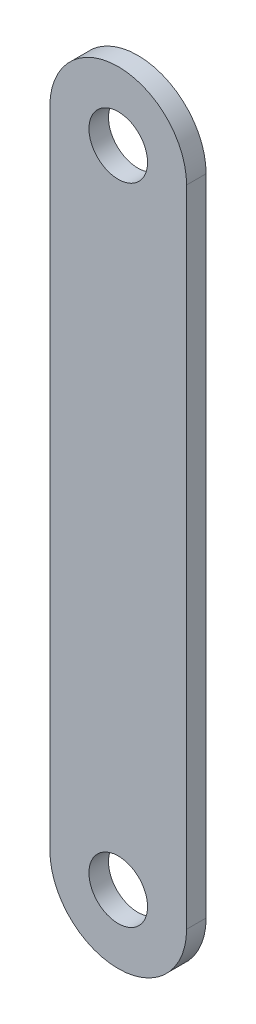
ISO-10303-21;
HEADER;
FILE_DESCRIPTION(('STEP AP214'),'2;1');
FILE_NAME('part.step','',(''),(''),'','','');
FILE_SCHEMA(('AUTOMOTIVE_DESIGN { 1 0 10303 214 1 1 1 1 }'));
ENDSEC;
DATA;
#1=APPLICATION_CONTEXT('core data for automotive mechanical design processes');
#2=APPLICATION_PROTOCOL_DEFINITION('international standard','automotive_design',2000,#1);
#3=PRODUCT_CONTEXT('',#1,'mechanical');
#4=PRODUCT('Part','Part','',(#3));
#5=PRODUCT_RELATED_PRODUCT_CATEGORY('part','',(#4));
#6=PRODUCT_DEFINITION_FORMATION('','',#4);
#7=PRODUCT_DEFINITION_CONTEXT('part definition',#1,'design');
#8=PRODUCT_DEFINITION('design','',#6,#7);
#9=PRODUCT_DEFINITION_SHAPE('','',#8);
#10=(LENGTH_UNIT() NAMED_UNIT(*) SI_UNIT(.MILLI.,.METRE.));
#11=(NAMED_UNIT(*) PLANE_ANGLE_UNIT() SI_UNIT($,.RADIAN.));
#12=(NAMED_UNIT(*) SI_UNIT($,.STERADIAN.) SOLID_ANGLE_UNIT());
#13=UNCERTAINTY_MEASURE_WITH_UNIT(LENGTH_MEASURE(1.E-05),#10,'distance_accuracy_value','');
#14=(GEOMETRIC_REPRESENTATION_CONTEXT(3) GLOBAL_UNCERTAINTY_ASSIGNED_CONTEXT((#13)) GLOBAL_UNIT_ASSIGNED_CONTEXT((#10,
#11,#12)) REPRESENTATION_CONTEXT('',''));
#15=CARTESIAN_POINT('',(0.,0.,0.));
#16=DIRECTION('',(0.,0.,1.));
#17=DIRECTION('',(1.,0.,0.));
#18=AXIS2_PLACEMENT_3D('',#15,#16,#17);
#19=CARTESIAN_POINT('',(0.,0.,1.));
#20=DIRECTION('',(0.,0.,1.));
#21=DIRECTION('',(1.,0.,0.));
#22=AXIS2_PLACEMENT_3D('',#19,#20,#21);
#23=PLANE('',#22);
#24=CARTESIAN_POINT('',(0.,33.,1.));
#25=DIRECTION('',(0.,0.,1.));
#26=DIRECTION('',(1.,0.,0.));
#27=AXIS2_PLACEMENT_3D('',#24,#25,#26);
#28=CIRCLE('',#27,1.5);
#29=CARTESIAN_POINT('',(1.5,33.,1.));
#30=VERTEX_POINT('',#29);
#31=EDGE_CURVE('E100',#30,#30,#28,.T.);
#32=ORIENTED_EDGE('',*,*,#31,.F.);
#33=EDGE_LOOP('',(#32));
#34=FACE_BOUND('',#33,.T.);
#35=CARTESIAN_POINT('',(0.,0.,1.));
#36=DIRECTION('',(0.,0.,1.));
#37=DIRECTION('',(1.,0.,0.));
#38=AXIS2_PLACEMENT_3D('',#35,#36,#37);
#39=CIRCLE('',#38,3.5);
#40=CARTESIAN_POINT('',(-3.5,0.,1.));
#41=VERTEX_POINT('',#40);
#42=CARTESIAN_POINT('',(3.5,0.,1.));
#43=VERTEX_POINT('',#42);
#44=EDGE_CURVE('E85',#41,#43,#39,.T.);
#45=ORIENTED_EDGE('',*,*,#44,.T.);
#46=DIRECTION('',(0.,1.,0.));
#47=VECTOR('',#46,1.);
#48=CARTESIAN_POINT('',(3.5,0.,1.));
#49=LINE('',#48,#47);
#50=CARTESIAN_POINT('',(3.5,33.,1.));
#51=VERTEX_POINT('',#50);
#52=EDGE_CURVE('E80',#43,#51,#49,.T.);
#53=ORIENTED_EDGE('',*,*,#52,.T.);
#54=CARTESIAN_POINT('',(0.,33.,1.));
#55=DIRECTION('',(0.,0.,1.));
#56=DIRECTION('',(1.,0.,0.));
#57=AXIS2_PLACEMENT_3D('',#54,#55,#56);
#58=CIRCLE('',#57,3.5);
#59=CARTESIAN_POINT('',(-3.5,33.,1.));
#60=VERTEX_POINT('',#59);
#61=EDGE_CURVE('E83',#51,#60,#58,.T.);
#62=ORIENTED_EDGE('',*,*,#61,.T.);
#63=DIRECTION('',(0.,-1.,0.));
#64=VECTOR('',#63,1.);
#65=CARTESIAN_POINT('',(-3.5,0.,1.));
#66=LINE('',#65,#64);
#67=EDGE_CURVE('E50',#60,#41,#66,.T.);
#68=ORIENTED_EDGE('',*,*,#67,.T.);
#69=EDGE_LOOP('',(#45,#53,#62,#68));
#70=FACE_BOUND('',#69,.T.);
#71=CARTESIAN_POINT('',(0.,0.,1.));
#72=DIRECTION('',(0.,0.,1.));
#73=DIRECTION('',(1.,0.,0.));
#74=AXIS2_PLACEMENT_3D('',#71,#72,#73);
#75=CIRCLE('',#74,1.5);
#76=CARTESIAN_POINT('',(1.5,0.,1.));
#77=VERTEX_POINT('',#76);
#78=EDGE_CURVE('E115',#77,#77,#75,.T.);
#79=ORIENTED_EDGE('',*,*,#78,.F.);
#80=EDGE_LOOP('',(#79));
#81=FACE_BOUND('',#80,.T.);
#82=ADVANCED_FACE('F33',(#34,#70,#81),#23,.T.);
#83=CARTESIAN_POINT('',(0.,0.,0.));
#84=DIRECTION('',(0.,0.,1.));
#85=DIRECTION('',(1.,0.,0.));
#86=AXIS2_PLACEMENT_3D('',#83,#84,#85);
#87=PLANE('',#86);
#88=CARTESIAN_POINT('',(0.,33.,0.));
#89=DIRECTION('',(0.,0.,1.));
#90=DIRECTION('',(1.,0.,0.));
#91=AXIS2_PLACEMENT_3D('',#88,#89,#90);
#92=CIRCLE('',#91,1.5);
#93=CARTESIAN_POINT('',(1.5,33.,0.));
#94=VERTEX_POINT('',#93);
#95=EDGE_CURVE('E112',#94,#94,#92,.T.);
#96=ORIENTED_EDGE('',*,*,#95,.T.);
#97=EDGE_LOOP('',(#96));
#98=FACE_BOUND('',#97,.T.);
#99=CARTESIAN_POINT('',(0.,0.,0.));
#100=DIRECTION('',(0.,0.,1.));
#101=DIRECTION('',(1.,0.,0.));
#102=AXIS2_PLACEMENT_3D('',#99,#100,#101);
#103=CIRCLE('',#102,3.5);
#104=CARTESIAN_POINT('',(-3.5,0.,0.));
#105=VERTEX_POINT('',#104);
#106=CARTESIAN_POINT('',(3.5,0.,0.));
#107=VERTEX_POINT('',#106);
#108=EDGE_CURVE('E97',#105,#107,#103,.T.);
#109=ORIENTED_EDGE('',*,*,#108,.F.);
#110=DIRECTION('',(0.,-1.,0.));
#111=VECTOR('',#110,1.);
#112=CARTESIAN_POINT('',(-3.5,0.,0.));
#113=LINE('',#112,#111);
#114=CARTESIAN_POINT('',(-3.5,33.,0.));
#115=VERTEX_POINT('',#114);
#116=EDGE_CURVE('E73',#115,#105,#113,.T.);
#117=ORIENTED_EDGE('',*,*,#116,.F.);
#118=CARTESIAN_POINT('',(0.,33.,0.));
#119=DIRECTION('',(0.,0.,1.));
#120=DIRECTION('',(1.,0.,0.));
#121=AXIS2_PLACEMENT_3D('',#118,#119,#120);
#122=CIRCLE('',#121,3.5);
#123=CARTESIAN_POINT('',(3.5,33.,0.));
#124=VERTEX_POINT('',#123);
#125=EDGE_CURVE('E67',#124,#115,#122,.T.);
#126=ORIENTED_EDGE('',*,*,#125,.F.);
#127=DIRECTION('',(0.,1.,0.));
#128=VECTOR('',#127,1.);
#129=CARTESIAN_POINT('',(3.5,0.,0.));
#130=LINE('',#129,#128);
#131=EDGE_CURVE('E89',#107,#124,#130,.T.);
#132=ORIENTED_EDGE('',*,*,#131,.F.);
#133=EDGE_LOOP('',(#109,#117,#126,#132));
#134=FACE_BOUND('',#133,.T.);
#135=CARTESIAN_POINT('',(0.,0.,0.));
#136=DIRECTION('',(0.,0.,1.));
#137=DIRECTION('',(1.,0.,0.));
#138=AXIS2_PLACEMENT_3D('',#135,#136,#137);
#139=CIRCLE('',#138,1.5);
#140=CARTESIAN_POINT('',(1.5,0.,0.));
#141=VERTEX_POINT('',#140);
#142=EDGE_CURVE('E118',#141,#141,#139,.T.);
#143=ORIENTED_EDGE('',*,*,#142,.T.);
#144=EDGE_LOOP('',(#143));
#145=FACE_BOUND('',#144,.T.);
#146=ADVANCED_FACE('F108',(#98,#134,#145),#87,.F.);
#147=CARTESIAN_POINT('',(0.,0.,1.));
#148=DIRECTION('',(0.,0.,-1.));
#149=DIRECTION('',(-1.,0.,0.));
#150=AXIS2_PLACEMENT_3D('',#147,#148,#149);
#151=CYLINDRICAL_SURFACE('',#150,3.5);
#152=ORIENTED_EDGE('',*,*,#108,.T.);
#153=DIRECTION('',(0.,0.,-1.));
#154=VECTOR('',#153,1.);
#155=CARTESIAN_POINT('',(3.5,0.,1.));
#156=LINE('',#155,#154);
#157=EDGE_CURVE('E11',#43,#107,#156,.T.);
#158=ORIENTED_EDGE('',*,*,#157,.F.);
#159=ORIENTED_EDGE('',*,*,#44,.F.);
#160=DIRECTION('',(0.,0.,-1.));
#161=VECTOR('',#160,1.);
#162=CARTESIAN_POINT('',(-3.5,0.,1.));
#163=LINE('',#162,#161);
#164=EDGE_CURVE('E93',#41,#105,#163,.T.);
#165=ORIENTED_EDGE('',*,*,#164,.T.);
#166=EDGE_LOOP('',(#152,#158,#159,#165));
#167=FACE_BOUND('',#166,.T.);
#168=ADVANCED_FACE('F35',(#167),#151,.T.);
#169=CARTESIAN_POINT('',(3.5,0.,1.));
#170=DIRECTION('',(-1.,0.,0.));
#171=DIRECTION('',(0.,0.,1.));
#172=AXIS2_PLACEMENT_3D('',#169,#170,#171);
#173=PLANE('',#172);
#174=ORIENTED_EDGE('',*,*,#131,.T.);
#175=DIRECTION('',(0.,0.,-1.));
#176=VECTOR('',#175,1.);
#177=CARTESIAN_POINT('',(3.5,33.,1.));
#178=LINE('',#177,#176);
#179=EDGE_CURVE('E42',#51,#124,#178,.T.);
#180=ORIENTED_EDGE('',*,*,#179,.F.);
#181=ORIENTED_EDGE('',*,*,#52,.F.);
#182=ORIENTED_EDGE('',*,*,#157,.T.);
#183=EDGE_LOOP('',(#174,#180,#181,#182));
#184=FACE_BOUND('',#183,.T.);
#185=ADVANCED_FACE('F88',(#184),#173,.F.);
#186=CARTESIAN_POINT('',(0.,33.,1.));
#187=DIRECTION('',(0.,0.,-1.));
#188=DIRECTION('',(-1.,0.,0.));
#189=AXIS2_PLACEMENT_3D('',#186,#187,#188);
#190=CYLINDRICAL_SURFACE('',#189,3.5);
#191=ORIENTED_EDGE('',*,*,#125,.T.);
#192=DIRECTION('',(0.,0.,-1.));
#193=VECTOR('',#192,1.);
#194=CARTESIAN_POINT('',(-3.5,33.,1.));
#195=LINE('',#194,#193);
#196=EDGE_CURVE('E90',#60,#115,#195,.T.);
#197=ORIENTED_EDGE('',*,*,#196,.F.);
#198=ORIENTED_EDGE('',*,*,#61,.F.);
#199=ORIENTED_EDGE('',*,*,#179,.T.);
#200=EDGE_LOOP('',(#191,#197,#198,#199));
#201=FACE_BOUND('',#200,.T.);
#202=ADVANCED_FACE('F91',(#201),#190,.T.);
#203=CARTESIAN_POINT('',(-3.5,0.,1.));
#204=DIRECTION('',(1.,0.,0.));
#205=DIRECTION('',(0.,0.,-1.));
#206=AXIS2_PLACEMENT_3D('',#203,#204,#205);
#207=PLANE('',#206);
#208=ORIENTED_EDGE('',*,*,#116,.T.);
#209=ORIENTED_EDGE('',*,*,#164,.F.);
#210=ORIENTED_EDGE('',*,*,#67,.F.);
#211=ORIENTED_EDGE('',*,*,#196,.T.);
#212=EDGE_LOOP('',(#208,#209,#210,#211));
#213=FACE_BOUND('',#212,.T.);
#214=ADVANCED_FACE('F105',(#213),#207,.F.);
#215=CARTESIAN_POINT('',(0.,33.,1.));
#216=DIRECTION('',(0.,0.,-1.));
#217=DIRECTION('',(-1.,0.,0.));
#218=AXIS2_PLACEMENT_3D('',#215,#216,#217);
#219=CYLINDRICAL_SURFACE('',#218,1.5);
#220=ORIENTED_EDGE('',*,*,#31,.T.);
#221=EDGE_LOOP('',(#220));
#222=FACE_BOUND('',#221,.T.);
#223=ORIENTED_EDGE('',*,*,#95,.F.);
#224=EDGE_LOOP('',(#223));
#225=FACE_BOUND('',#224,.T.);
#226=ADVANCED_FACE('F136',(#222,#225),#219,.F.);
#227=CARTESIAN_POINT('',(0.,0.,1.));
#228=DIRECTION('',(0.,0.,-1.));
#229=DIRECTION('',(-1.,0.,0.));
#230=AXIS2_PLACEMENT_3D('',#227,#228,#229);
#231=CYLINDRICAL_SURFACE('',#230,1.5);
#232=ORIENTED_EDGE('',*,*,#78,.T.);
#233=EDGE_LOOP('',(#232));
#234=FACE_BOUND('',#233,.T.);
#235=ORIENTED_EDGE('',*,*,#142,.F.);
#236=EDGE_LOOP('',(#235));
#237=FACE_BOUND('',#236,.T.);
#238=ADVANCED_FACE('F124',(#234,#237),#231,.F.);
#239=CLOSED_SHELL('',(#82,#146,#168,#185,#202,#214,#226,#238));
#240=MANIFOLD_SOLID_BREP('B2',#239);
#241=ADVANCED_BREP_SHAPE_REPRESENTATION('',(#18,#240),#14);
#242=SHAPE_DEFINITION_REPRESENTATION(#9,#241);
ENDSEC;
END-ISO-10303-21;
